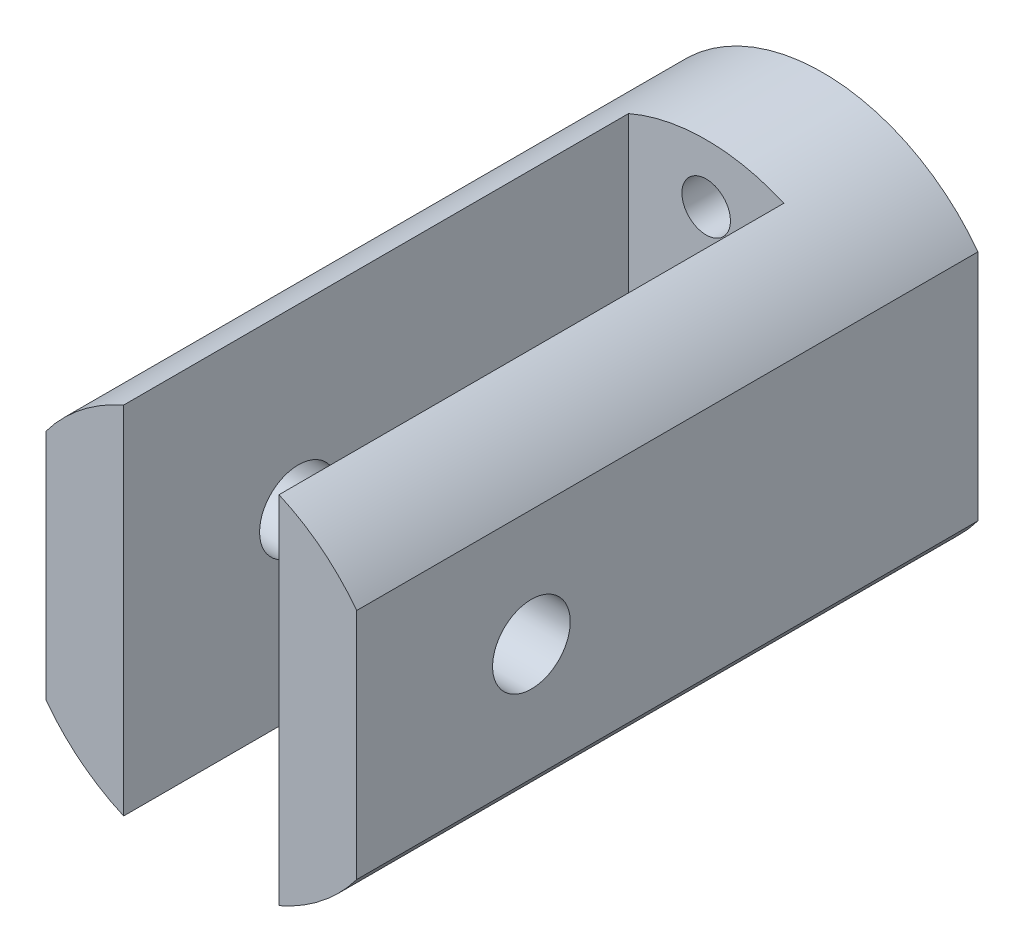
ISO-10303-21;
HEADER;
FILE_DESCRIPTION(('STEP AP214'),'2;1');
FILE_NAME('part.step','',(''),(''),'','','');
FILE_SCHEMA(('AUTOMOTIVE_DESIGN { 1 0 10303 214 1 1 1 1 }'));
ENDSEC;
DATA;
#1=APPLICATION_CONTEXT('core data for automotive mechanical design processes');
#2=APPLICATION_PROTOCOL_DEFINITION('international standard','automotive_design',2000,#1);
#3=PRODUCT_CONTEXT('',#1,'mechanical');
#4=PRODUCT('Part','Part','',(#3));
#5=PRODUCT_RELATED_PRODUCT_CATEGORY('part','',(#4));
#6=PRODUCT_DEFINITION_FORMATION('','',#4);
#7=PRODUCT_DEFINITION_CONTEXT('part definition',#1,'design');
#8=PRODUCT_DEFINITION('design','',#6,#7);
#9=PRODUCT_DEFINITION_SHAPE('','',#8);
#10=(LENGTH_UNIT() NAMED_UNIT(*) SI_UNIT(.MILLI.,.METRE.));
#11=(NAMED_UNIT(*) PLANE_ANGLE_UNIT() SI_UNIT($,.RADIAN.));
#12=(NAMED_UNIT(*) SI_UNIT($,.STERADIAN.) SOLID_ANGLE_UNIT());
#13=UNCERTAINTY_MEASURE_WITH_UNIT(LENGTH_MEASURE(1.E-05),#10,'distance_accuracy_value','');
#14=(GEOMETRIC_REPRESENTATION_CONTEXT(3) GLOBAL_UNCERTAINTY_ASSIGNED_CONTEXT((#13)) GLOBAL_UNIT_ASSIGNED_CONTEXT((#10,
#11,#12)) REPRESENTATION_CONTEXT('',''));
#15=CARTESIAN_POINT('',(0.,0.,0.));
#16=DIRECTION('',(0.,0.,1.));
#17=DIRECTION('',(1.,0.,0.));
#18=AXIS2_PLACEMENT_3D('',#15,#16,#17);
#19=CARTESIAN_POINT('',(0.,0.,32.));
#20=DIRECTION('',(0.,0.,-1.));
#21=DIRECTION('',(-1.,0.,0.));
#22=AXIS2_PLACEMENT_3D('',#19,#20,#21);
#23=CYLINDRICAL_SURFACE('',#22,10.);
#24=CARTESIAN_POINT('',(0.,0.,32.));
#25=DIRECTION('',(0.,0.,1.));
#26=DIRECTION('',(1.,0.,0.));
#27=AXIS2_PLACEMENT_3D('',#24,#25,#26);
#28=CIRCLE('',#27,10.);
#29=CARTESIAN_POINT('',(8.00000000000001,5.99999999999999,32.));
#30=VERTEX_POINT('',#29);
#31=CARTESIAN_POINT('',(4.,9.16515138991168,32.));
#32=VERTEX_POINT('',#31);
#33=EDGE_CURVE('E124',#30,#32,#28,.T.);
#34=ORIENTED_EDGE('',*,*,#33,.F.);
#35=DIRECTION('',(0.,0.,-1.));
#36=VECTOR('',#35,1.);
#37=CARTESIAN_POINT('',(8.00000000000001,6.,32.));
#38=LINE('',#37,#36);
#39=CARTESIAN_POINT('',(8.,6.,0.));
#40=VERTEX_POINT('',#39);
#41=EDGE_CURVE('E104',#30,#40,#38,.T.);
#42=ORIENTED_EDGE('',*,*,#41,.T.);
#43=CARTESIAN_POINT('',(0.,0.,0.));
#44=DIRECTION('',(0.,0.,1.));
#45=DIRECTION('',(1.,0.,0.));
#46=AXIS2_PLACEMENT_3D('',#43,#44,#45);
#47=CIRCLE('',#46,10.);
#48=CARTESIAN_POINT('',(-8.,6.,0.));
#49=VERTEX_POINT('',#48);
#50=EDGE_CURVE('E60',#40,#49,#47,.T.);
#51=ORIENTED_EDGE('',*,*,#50,.T.);
#52=DIRECTION('',(0.,0.,-1.));
#53=VECTOR('',#52,1.);
#54=CARTESIAN_POINT('',(-8.,6.00000000000001,32.));
#55=LINE('',#54,#53);
#56=CARTESIAN_POINT('',(-8.,6.00000000000001,32.));
#57=VERTEX_POINT('',#56);
#58=EDGE_CURVE('E162',#49,#57,#55,.F.);
#59=ORIENTED_EDGE('',*,*,#58,.T.);
#60=CARTESIAN_POINT('',(-4.,9.16515138991168,32.));
#61=VERTEX_POINT('',#60);
#62=EDGE_CURVE('E126',#61,#57,#28,.T.);
#63=ORIENTED_EDGE('',*,*,#62,.F.);
#64=DIRECTION('',(0.,0.,-1.));
#65=VECTOR('',#64,1.);
#66=CARTESIAN_POINT('',(-4.,9.16515138991168,32.));
#67=LINE('',#66,#65);
#68=CARTESIAN_POINT('',(-4.,9.16515138991168,6.));
#69=VERTEX_POINT('',#68);
#70=EDGE_CURVE('E174',#61,#69,#67,.T.);
#71=ORIENTED_EDGE('',*,*,#70,.T.);
#72=CARTESIAN_POINT('',(0.,0.,6.));
#73=DIRECTION('',(0.,0.,-1.));
#74=DIRECTION('',(-1.,0.,0.));
#75=AXIS2_PLACEMENT_3D('',#72,#73,#74);
#76=CIRCLE('',#75,10.);
#77=CARTESIAN_POINT('',(4.,9.16515138991168,6.));
#78=VERTEX_POINT('',#77);
#79=EDGE_CURVE('E139',#69,#78,#76,.T.);
#80=ORIENTED_EDGE('',*,*,#79,.T.);
#81=DIRECTION('',(0.,0.,-1.));
#82=VECTOR('',#81,1.);
#83=CARTESIAN_POINT('',(4.,9.16515138991168,32.));
#84=LINE('',#83,#82);
#85=EDGE_CURVE('E177',#78,#32,#84,.F.);
#86=ORIENTED_EDGE('',*,*,#85,.T.);
#87=EDGE_LOOP('',(#34,#42,#51,#59,#63,#71,#80,#86));
#88=FACE_BOUND('',#87,.T.);
#89=ADVANCED_FACE('F36',(#88),#23,.T.);
#90=CARTESIAN_POINT('',(0.,0.,32.));
#91=DIRECTION('',(0.,0.,1.));
#92=DIRECTION('',(1.,0.,0.));
#93=AXIS2_PLACEMENT_3D('',#90,#91,#92);
#94=PLANE('',#93);
#95=DIRECTION('',(0.,1.,0.));
#96=VECTOR('',#95,1.);
#97=CARTESIAN_POINT('',(8.00000000000001,-10.,32.));
#98=LINE('',#97,#96);
#99=CARTESIAN_POINT('',(8.00000000000001,-6.,32.));
#100=VERTEX_POINT('',#99);
#101=EDGE_CURVE('E102',#100,#30,#98,.T.);
#102=ORIENTED_EDGE('',*,*,#101,.T.);
#103=ORIENTED_EDGE('',*,*,#33,.T.);
#104=DIRECTION('',(0.,1.,0.));
#105=VECTOR('',#104,1.);
#106=CARTESIAN_POINT('',(4.,0.,32.));
#107=LINE('',#106,#105);
#108=CARTESIAN_POINT('',(4.,-9.16515138991168,32.));
#109=VERTEX_POINT('',#108);
#110=EDGE_CURVE('E122',#109,#32,#107,.T.);
#111=ORIENTED_EDGE('',*,*,#110,.F.);
#112=EDGE_CURVE('E114',#109,#100,#28,.T.);
#113=ORIENTED_EDGE('',*,*,#112,.T.);
#114=EDGE_LOOP('',(#102,#103,#111,#113));
#115=FACE_BOUND('',#114,.T.);
#116=ADVANCED_FACE('F120',(#115),#94,.T.);
#117=CARTESIAN_POINT('',(-8.,-6.,0.));
#118=VERTEX_POINT('',#117);
#119=CARTESIAN_POINT('',(8.,-6.,0.));
#120=VERTEX_POINT('',#119);
#121=EDGE_CURVE('E117',#118,#120,#47,.T.);
#122=ORIENTED_EDGE('',*,*,#121,.T.);
#123=DIRECTION('',(0.,0.,-1.));
#124=VECTOR('',#123,1.);
#125=CARTESIAN_POINT('',(8.00000000000001,-6.,32.));
#126=LINE('',#125,#124);
#127=EDGE_CURVE('E53',#120,#100,#126,.F.);
#128=ORIENTED_EDGE('',*,*,#127,.T.);
#129=ORIENTED_EDGE('',*,*,#112,.F.);
#130=DIRECTION('',(0.,0.,-1.));
#131=VECTOR('',#130,1.);
#132=CARTESIAN_POINT('',(4.,-9.16515138991168,32.));
#133=LINE('',#132,#131);
#134=CARTESIAN_POINT('',(4.,-9.16515138991168,6.));
#135=VERTEX_POINT('',#134);
#136=EDGE_CURVE('E179',#109,#135,#133,.T.);
#137=ORIENTED_EDGE('',*,*,#136,.T.);
#138=CARTESIAN_POINT('',(-4.,-9.16515138991168,6.));
#139=VERTEX_POINT('',#138);
#140=EDGE_CURVE('E144',#135,#139,#76,.T.);
#141=ORIENTED_EDGE('',*,*,#140,.T.);
#142=DIRECTION('',(0.,0.,-1.));
#143=VECTOR('',#142,1.);
#144=CARTESIAN_POINT('',(-4.,-9.16515138991168,32.));
#145=LINE('',#144,#143);
#146=CARTESIAN_POINT('',(-4.,-9.16515138991168,32.));
#147=VERTEX_POINT('',#146);
#148=EDGE_CURVE('E170',#139,#147,#145,.F.);
#149=ORIENTED_EDGE('',*,*,#148,.T.);
#150=CARTESIAN_POINT('',(-8.,-6.00000000000001,32.));
#151=VERTEX_POINT('',#150);
#152=EDGE_CURVE('E123',#151,#147,#28,.T.);
#153=ORIENTED_EDGE('',*,*,#152,.F.);
#154=DIRECTION('',(0.,0.,-1.));
#155=VECTOR('',#154,1.);
#156=CARTESIAN_POINT('',(-8.,-6.00000000000001,32.));
#157=LINE('',#156,#155);
#158=EDGE_CURVE('E164',#151,#118,#157,.T.);
#159=ORIENTED_EDGE('',*,*,#158,.T.);
#160=EDGE_LOOP('',(#122,#128,#129,#137,#141,#149,#153,#159));
#161=FACE_BOUND('',#160,.T.);
#162=ADVANCED_FACE('F38',(#161),#23,.T.);
#163=DIRECTION('',(0.,1.,0.));
#164=VECTOR('',#163,1.);
#165=CARTESIAN_POINT('',(-8.,-10.,32.));
#166=LINE('',#165,#164);
#167=EDGE_CURVE('E160',#151,#57,#166,.T.);
#168=ORIENTED_EDGE('',*,*,#167,.F.);
#169=ORIENTED_EDGE('',*,*,#152,.T.);
#170=DIRECTION('',(0.,-1.,0.));
#171=VECTOR('',#170,1.);
#172=CARTESIAN_POINT('',(-4.,0.,32.));
#173=LINE('',#172,#171);
#174=EDGE_CURVE('E130',#61,#147,#173,.T.);
#175=ORIENTED_EDGE('',*,*,#174,.F.);
#176=ORIENTED_EDGE('',*,*,#62,.T.);
#177=EDGE_LOOP('',(#168,#169,#175,#176));
#178=FACE_BOUND('',#177,.T.);
#179=ADVANCED_FACE('F188',(#178),#94,.T.);
#180=CARTESIAN_POINT('',(0.,0.,0.));
#181=DIRECTION('',(0.,0.,1.));
#182=DIRECTION('',(1.,0.,0.));
#183=AXIS2_PLACEMENT_3D('',#180,#181,#182);
#184=PLANE('',#183);
#185=CARTESIAN_POINT('',(0.,-7.,0.));
#186=DIRECTION('',(0.,0.,-1.));
#187=DIRECTION('',(1.,0.,0.));
#188=AXIS2_PLACEMENT_3D('',#185,#186,#187);
#189=CIRCLE('',#188,1.25);
#190=CARTESIAN_POINT('',(1.25,-7.,0.));
#191=VERTEX_POINT('',#190);
#192=EDGE_CURVE('E155',#191,#191,#189,.T.);
#193=ORIENTED_EDGE('',*,*,#192,.F.);
#194=EDGE_LOOP('',(#193));
#195=FACE_BOUND('',#194,.T.);
#196=CARTESIAN_POINT('',(0.,7.,0.));
#197=DIRECTION('',(0.,0.,-1.));
#198=DIRECTION('',(-1.,0.,0.));
#199=AXIS2_PLACEMENT_3D('',#196,#197,#198);
#200=CIRCLE('',#199,1.25);
#201=CARTESIAN_POINT('',(-1.25,7.,0.));
#202=VERTEX_POINT('',#201);
#203=EDGE_CURVE('E147',#202,#202,#200,.T.);
#204=ORIENTED_EDGE('',*,*,#203,.F.);
#205=EDGE_LOOP('',(#204));
#206=FACE_BOUND('',#205,.T.);
#207=ORIENTED_EDGE('',*,*,#50,.F.);
#208=DIRECTION('',(0.,-1.,0.));
#209=VECTOR('',#208,1.);
#210=CARTESIAN_POINT('',(8.,0.,0.));
#211=LINE('',#210,#209);
#212=EDGE_CURVE('E11',#40,#120,#211,.T.);
#213=ORIENTED_EDGE('',*,*,#212,.T.);
#214=ORIENTED_EDGE('',*,*,#121,.F.);
#215=DIRECTION('',(0.,1.,0.));
#216=VECTOR('',#215,1.);
#217=CARTESIAN_POINT('',(-8.,0.,0.));
#218=LINE('',#217,#216);
#219=EDGE_CURVE('E45',#118,#49,#218,.T.);
#220=ORIENTED_EDGE('',*,*,#219,.T.);
#221=EDGE_LOOP('',(#207,#213,#214,#220));
#222=FACE_BOUND('',#221,.T.);
#223=ADVANCED_FACE('F192',(#195,#206,#222),#184,.F.);
#224=CARTESIAN_POINT('',(-4.,-10.,6.));
#225=DIRECTION('',(0.,0.,-1.));
#226=DIRECTION('',(-1.,0.,0.));
#227=AXIS2_PLACEMENT_3D('',#224,#225,#226);
#228=PLANE('',#227);
#229=CARTESIAN_POINT('',(0.,-7.,6.));
#230=DIRECTION('',(0.,0.,-1.));
#231=DIRECTION('',(-1.,0.,0.));
#232=AXIS2_PLACEMENT_3D('',#229,#230,#231);
#233=CIRCLE('',#232,1.25);
#234=CARTESIAN_POINT('',(-1.25,-7.,6.));
#235=VERTEX_POINT('',#234);
#236=EDGE_CURVE('E40',#235,#235,#233,.T.);
#237=ORIENTED_EDGE('',*,*,#236,.T.);
#238=EDGE_LOOP('',(#237));
#239=FACE_BOUND('',#238,.T.);
#240=CARTESIAN_POINT('',(0.,7.,6.));
#241=DIRECTION('',(0.,0.,-1.));
#242=DIRECTION('',(-1.,0.,0.));
#243=AXIS2_PLACEMENT_3D('',#240,#241,#242);
#244=CIRCLE('',#243,1.25);
#245=CARTESIAN_POINT('',(-1.25,7.,6.));
#246=VERTEX_POINT('',#245);
#247=EDGE_CURVE('E108',#246,#246,#244,.T.);
#248=ORIENTED_EDGE('',*,*,#247,.T.);
#249=EDGE_LOOP('',(#248));
#250=FACE_BOUND('',#249,.T.);
#251=DIRECTION('',(0.,1.,0.));
#252=VECTOR('',#251,1.);
#253=CARTESIAN_POINT('',(-4.,-10.,6.));
#254=LINE('',#253,#252);
#255=EDGE_CURVE('E167',#139,#69,#254,.T.);
#256=ORIENTED_EDGE('',*,*,#255,.F.);
#257=ORIENTED_EDGE('',*,*,#140,.F.);
#258=DIRECTION('',(0.,1.,0.));
#259=VECTOR('',#258,1.);
#260=CARTESIAN_POINT('',(4.,-10.,6.));
#261=LINE('',#260,#259);
#262=EDGE_CURVE('E166',#135,#78,#261,.T.);
#263=ORIENTED_EDGE('',*,*,#262,.T.);
#264=ORIENTED_EDGE('',*,*,#79,.F.);
#265=EDGE_LOOP('',(#256,#257,#263,#264));
#266=FACE_BOUND('',#265,.T.);
#267=ADVANCED_FACE('F186',(#239,#250,#266),#228,.F.);
#268=CARTESIAN_POINT('',(4.,-10.,6.));
#269=DIRECTION('',(1.,0.,0.));
#270=DIRECTION('',(0.,0.,-1.));
#271=AXIS2_PLACEMENT_3D('',#268,#269,#270);
#272=PLANE('',#271);
#273=CARTESIAN_POINT('',(4.,0.,23.));
#274=DIRECTION('',(1.,0.,0.));
#275=DIRECTION('',(0.,0.,-1.));
#276=AXIS2_PLACEMENT_3D('',#273,#274,#275);
#277=CIRCLE('',#276,2.);
#278=CARTESIAN_POINT('',(4.,0.,21.));
#279=VERTEX_POINT('',#278);
#280=EDGE_CURVE('E245',#279,#279,#277,.T.);
#281=ORIENTED_EDGE('',*,*,#280,.T.);
#282=EDGE_LOOP('',(#281));
#283=FACE_BOUND('',#282,.T.);
#284=ORIENTED_EDGE('',*,*,#110,.T.);
#285=ORIENTED_EDGE('',*,*,#85,.F.);
#286=ORIENTED_EDGE('',*,*,#262,.F.);
#287=ORIENTED_EDGE('',*,*,#136,.F.);
#288=EDGE_LOOP('',(#284,#285,#286,#287));
#289=FACE_BOUND('',#288,.T.);
#290=ADVANCED_FACE('F183',(#283,#289),#272,.F.);
#291=CARTESIAN_POINT('',(-4.,-10.,6.));
#292=DIRECTION('',(-1.,0.,0.));
#293=DIRECTION('',(0.,0.,1.));
#294=AXIS2_PLACEMENT_3D('',#291,#292,#293);
#295=PLANE('',#294);
#296=CARTESIAN_POINT('',(-4.,0.,23.));
#297=DIRECTION('',(-1.,0.,0.));
#298=DIRECTION('',(0.,0.,1.));
#299=AXIS2_PLACEMENT_3D('',#296,#297,#298);
#300=CIRCLE('',#299,2.);
#301=CARTESIAN_POINT('',(-4.,0.,25.));
#302=VERTEX_POINT('',#301);
#303=EDGE_CURVE('E247',#302,#302,#300,.T.);
#304=ORIENTED_EDGE('',*,*,#303,.T.);
#305=EDGE_LOOP('',(#304));
#306=FACE_BOUND('',#305,.T.);
#307=ORIENTED_EDGE('',*,*,#174,.T.);
#308=ORIENTED_EDGE('',*,*,#148,.F.);
#309=ORIENTED_EDGE('',*,*,#255,.T.);
#310=ORIENTED_EDGE('',*,*,#70,.F.);
#311=EDGE_LOOP('',(#307,#308,#309,#310));
#312=FACE_BOUND('',#311,.T.);
#313=ADVANCED_FACE('F187',(#306,#312),#295,.F.);
#314=CARTESIAN_POINT('',(-8.,-10.,0.));
#315=DIRECTION('',(1.,0.,0.));
#316=DIRECTION('',(0.,0.,-1.));
#317=AXIS2_PLACEMENT_3D('',#314,#315,#316);
#318=PLANE('',#317);
#319=CARTESIAN_POINT('',(-8.,0.,23.));
#320=DIRECTION('',(1.,0.,0.));
#321=DIRECTION('',(0.,0.,-1.));
#322=AXIS2_PLACEMENT_3D('',#319,#320,#321);
#323=CIRCLE('',#322,2.);
#324=CARTESIAN_POINT('',(-8.,0.,21.));
#325=VERTEX_POINT('',#324);
#326=EDGE_CURVE('E250',#325,#325,#323,.T.);
#327=ORIENTED_EDGE('',*,*,#326,.T.);
#328=EDGE_LOOP('',(#327));
#329=FACE_BOUND('',#328,.T.);
#330=ORIENTED_EDGE('',*,*,#167,.T.);
#331=ORIENTED_EDGE('',*,*,#58,.F.);
#332=ORIENTED_EDGE('',*,*,#219,.F.);
#333=ORIENTED_EDGE('',*,*,#158,.F.);
#334=EDGE_LOOP('',(#330,#331,#332,#333));
#335=FACE_BOUND('',#334,.T.);
#336=ADVANCED_FACE('F193',(#329,#335),#318,.F.);
#337=CARTESIAN_POINT('',(8.,-10.,0.));
#338=DIRECTION('',(-1.,0.,0.));
#339=DIRECTION('',(0.,0.,1.));
#340=AXIS2_PLACEMENT_3D('',#337,#338,#339);
#341=PLANE('',#340);
#342=CARTESIAN_POINT('',(8.00000000000001,0.,23.));
#343=DIRECTION('',(1.,0.,0.));
#344=DIRECTION('',(0.,0.,-1.));
#345=AXIS2_PLACEMENT_3D('',#342,#343,#344);
#346=CIRCLE('',#345,2.);
#347=CARTESIAN_POINT('',(8.00000000000001,0.,21.));
#348=VERTEX_POINT('',#347);
#349=EDGE_CURVE('E254',#348,#348,#346,.T.);
#350=ORIENTED_EDGE('',*,*,#349,.F.);
#351=EDGE_LOOP('',(#350));
#352=FACE_BOUND('',#351,.T.);
#353=ORIENTED_EDGE('',*,*,#101,.F.);
#354=ORIENTED_EDGE('',*,*,#127,.F.);
#355=ORIENTED_EDGE('',*,*,#212,.F.);
#356=ORIENTED_EDGE('',*,*,#41,.F.);
#357=EDGE_LOOP('',(#353,#354,#355,#356));
#358=FACE_BOUND('',#357,.T.);
#359=ADVANCED_FACE('F103',(#352,#358),#341,.F.);
#360=CARTESIAN_POINT('',(0.,7.,32.));
#361=DIRECTION('',(0.,0.,-1.));
#362=DIRECTION('',(-1.,0.,0.));
#363=AXIS2_PLACEMENT_3D('',#360,#361,#362);
#364=CYLINDRICAL_SURFACE('',#363,1.25);
#365=ORIENTED_EDGE('',*,*,#203,.T.);
#366=EDGE_LOOP('',(#365));
#367=FACE_BOUND('',#366,.T.);
#368=ORIENTED_EDGE('',*,*,#247,.F.);
#369=EDGE_LOOP('',(#368));
#370=FACE_BOUND('',#369,.T.);
#371=ADVANCED_FACE('F201',(#367,#370),#364,.F.);
#372=CARTESIAN_POINT('',(0.,-7.,32.));
#373=DIRECTION('',(0.,0.,-1.));
#374=DIRECTION('',(-1.,0.,0.));
#375=AXIS2_PLACEMENT_3D('',#372,#373,#374);
#376=CYLINDRICAL_SURFACE('',#375,1.25);
#377=ORIENTED_EDGE('',*,*,#192,.T.);
#378=EDGE_LOOP('',(#377));
#379=FACE_BOUND('',#378,.T.);
#380=ORIENTED_EDGE('',*,*,#236,.F.);
#381=EDGE_LOOP('',(#380));
#382=FACE_BOUND('',#381,.T.);
#383=ADVANCED_FACE('F230',(#379,#382),#376,.F.);
#384=CARTESIAN_POINT('',(-8.,0.,23.));
#385=DIRECTION('',(1.,0.,0.));
#386=DIRECTION('',(0.,0.,-1.));
#387=AXIS2_PLACEMENT_3D('',#384,#385,#386);
#388=CYLINDRICAL_SURFACE('',#387,2.);
#389=ORIENTED_EDGE('',*,*,#349,.T.);
#390=EDGE_LOOP('',(#389));
#391=FACE_BOUND('',#390,.T.);
#392=ORIENTED_EDGE('',*,*,#280,.F.);
#393=EDGE_LOOP('',(#392));
#394=FACE_BOUND('',#393,.T.);
#395=ADVANCED_FACE('F232',(#391,#394),#388,.F.);
#396=ORIENTED_EDGE('',*,*,#326,.F.);
#397=EDGE_LOOP('',(#396));
#398=FACE_BOUND('',#397,.T.);
#399=ORIENTED_EDGE('',*,*,#303,.F.);
#400=EDGE_LOOP('',(#399));
#401=FACE_BOUND('',#400,.T.);
#402=ADVANCED_FACE('F239',(#398,#401),#388,.F.);
#403=CLOSED_SHELL('',(#89,#116,#162,#179,#223,#267,#290,#313,#336,#359,#371,#383,#395,#402));
#404=MANIFOLD_SOLID_BREP('B2',#403);
#405=ADVANCED_BREP_SHAPE_REPRESENTATION('',(#18,#404),#14);
#406=SHAPE_DEFINITION_REPRESENTATION(#9,#405);
ENDSEC;
END-ISO-10303-21;
